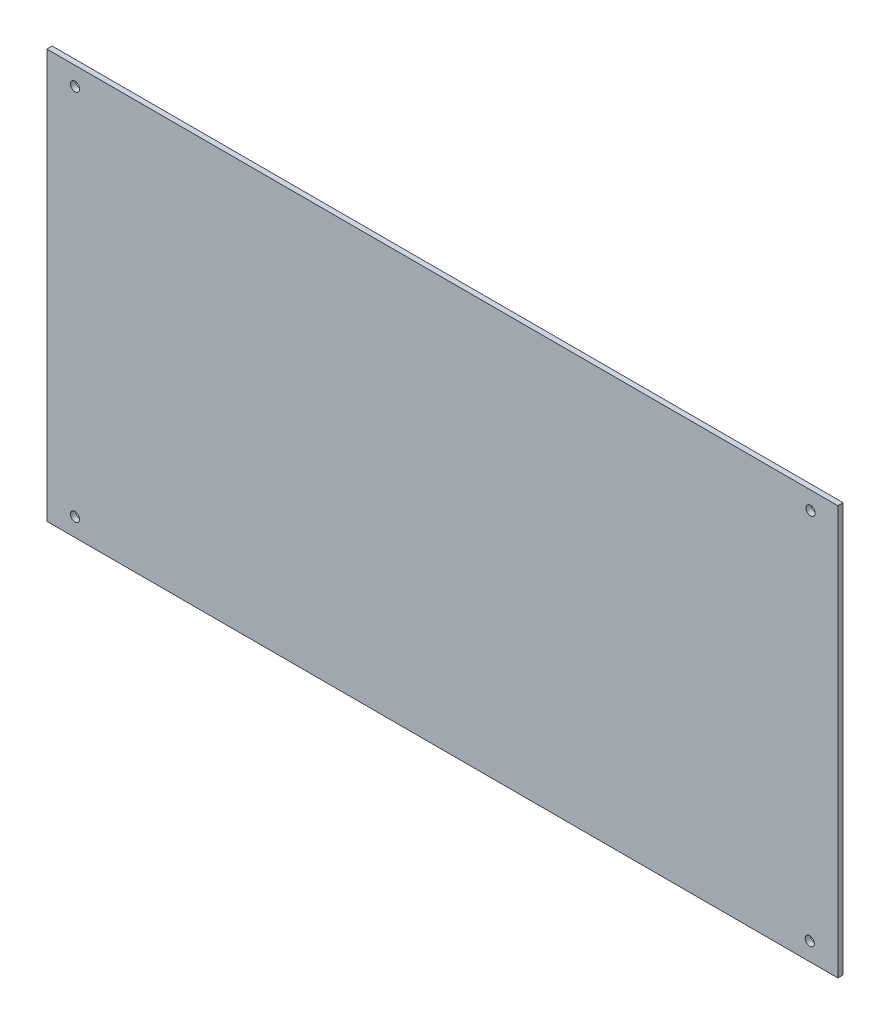
ISO-10303-21;
HEADER;
FILE_DESCRIPTION(('STEP AP214'),'2;1');
FILE_NAME('part.step','',(''),(''),'','','');
FILE_SCHEMA(('AUTOMOTIVE_DESIGN { 1 0 10303 214 1 1 1 1 }'));
ENDSEC;
DATA;
#1=APPLICATION_CONTEXT('core data for automotive mechanical design processes');
#2=APPLICATION_PROTOCOL_DEFINITION('international standard','automotive_design',2000,#1);
#3=PRODUCT_CONTEXT('',#1,'mechanical');
#4=PRODUCT('Part','Part','',(#3));
#5=PRODUCT_RELATED_PRODUCT_CATEGORY('part','',(#4));
#6=PRODUCT_DEFINITION_FORMATION('','',#4);
#7=PRODUCT_DEFINITION_CONTEXT('part definition',#1,'design');
#8=PRODUCT_DEFINITION('design','',#6,#7);
#9=PRODUCT_DEFINITION_SHAPE('','',#8);
#10=(LENGTH_UNIT() NAMED_UNIT(*) SI_UNIT(.MILLI.,.METRE.));
#11=(NAMED_UNIT(*) PLANE_ANGLE_UNIT() SI_UNIT($,.RADIAN.));
#12=(NAMED_UNIT(*) SI_UNIT($,.STERADIAN.) SOLID_ANGLE_UNIT());
#13=UNCERTAINTY_MEASURE_WITH_UNIT(LENGTH_MEASURE(1.E-05),#10,'distance_accuracy_value','');
#14=(GEOMETRIC_REPRESENTATION_CONTEXT(3) GLOBAL_UNCERTAINTY_ASSIGNED_CONTEXT((#13)) GLOBAL_UNIT_ASSIGNED_CONTEXT((#10,
#11,#12)) REPRESENTATION_CONTEXT('',''));
#15=CARTESIAN_POINT('',(0.,0.,0.));
#16=DIRECTION('',(0.,0.,1.));
#17=DIRECTION('',(1.,0.,0.));
#18=AXIS2_PLACEMENT_3D('',#15,#16,#17);
#19=CARTESIAN_POINT('',(0.,0.,3.));
#20=DIRECTION('',(-1.,0.,0.));
#21=DIRECTION('',(0.,0.,1.));
#22=AXIS2_PLACEMENT_3D('',#19,#20,#21);
#23=PLANE('',#22);
#24=DIRECTION('',(0.,1.,0.));
#25=VECTOR('',#24,1.);
#26=CARTESIAN_POINT('',(0.,0.,0.));
#27=LINE('',#26,#25);
#28=CARTESIAN_POINT('',(0.,0.,0.));
#29=VERTEX_POINT('',#28);
#30=CARTESIAN_POINT('',(0.,232.85,0.));
#31=VERTEX_POINT('',#30);
#32=EDGE_CURVE('E113',#29,#31,#27,.T.);
#33=ORIENTED_EDGE('',*,*,#32,.T.);
#34=DIRECTION('',(0.,0.,-1.));
#35=VECTOR('',#34,1.);
#36=CARTESIAN_POINT('',(0.,232.85,3.));
#37=LINE('',#36,#35);
#38=CARTESIAN_POINT('',(0.,232.85,3.));
#39=VERTEX_POINT('',#38);
#40=EDGE_CURVE('E13',#39,#31,#37,.T.);
#41=ORIENTED_EDGE('',*,*,#40,.F.);
#42=DIRECTION('',(0.,1.,0.));
#43=VECTOR('',#42,1.);
#44=CARTESIAN_POINT('',(0.,0.,3.));
#45=LINE('',#44,#43);
#46=CARTESIAN_POINT('',(0.,0.,3.));
#47=VERTEX_POINT('',#46);
#48=EDGE_CURVE('E100',#47,#39,#45,.T.);
#49=ORIENTED_EDGE('',*,*,#48,.F.);
#50=DIRECTION('',(0.,0.,-1.));
#51=VECTOR('',#50,1.);
#52=CARTESIAN_POINT('',(0.,0.,3.));
#53=LINE('',#52,#51);
#54=EDGE_CURVE('E109',#47,#29,#53,.T.);
#55=ORIENTED_EDGE('',*,*,#54,.T.);
#56=EDGE_LOOP('',(#33,#41,#49,#55));
#57=FACE_BOUND('',#56,.T.);
#58=ADVANCED_FACE('F47',(#57),#23,.F.);
#59=CARTESIAN_POINT('',(0.,232.85,3.));
#60=DIRECTION('',(0.,-1.,0.));
#61=DIRECTION('',(1.,0.,0.));
#62=AXIS2_PLACEMENT_3D('',#59,#60,#61);
#63=PLANE('',#62);
#64=DIRECTION('',(-1.,0.,0.));
#65=VECTOR('',#64,1.);
#66=CARTESIAN_POINT('',(0.,232.85,0.));
#67=LINE('',#66,#65);
#68=CARTESIAN_POINT('',(-450.3,232.85,0.));
#69=VERTEX_POINT('',#68);
#70=EDGE_CURVE('E104',#31,#69,#67,.T.);
#71=ORIENTED_EDGE('',*,*,#70,.T.);
#72=DIRECTION('',(0.,0.,-1.));
#73=VECTOR('',#72,1.);
#74=CARTESIAN_POINT('',(-450.3,232.85,3.));
#75=LINE('',#74,#73);
#76=CARTESIAN_POINT('',(-450.3,232.85,3.));
#77=VERTEX_POINT('',#76);
#78=EDGE_CURVE('E56',#77,#69,#75,.T.);
#79=ORIENTED_EDGE('',*,*,#78,.F.);
#80=DIRECTION('',(-1.,0.,0.));
#81=VECTOR('',#80,1.);
#82=CARTESIAN_POINT('',(0.,232.85,3.));
#83=LINE('',#82,#81);
#84=EDGE_CURVE('E95',#39,#77,#83,.T.);
#85=ORIENTED_EDGE('',*,*,#84,.F.);
#86=ORIENTED_EDGE('',*,*,#40,.T.);
#87=EDGE_LOOP('',(#71,#79,#85,#86));
#88=FACE_BOUND('',#87,.T.);
#89=ADVANCED_FACE('F103',(#88),#63,.F.);
#90=CARTESIAN_POINT('',(-450.3,0.,3.));
#91=DIRECTION('',(1.,0.,0.));
#92=DIRECTION('',(0.,0.,-1.));
#93=AXIS2_PLACEMENT_3D('',#90,#91,#92);
#94=PLANE('',#93);
#95=DIRECTION('',(0.,-1.,0.));
#96=VECTOR('',#95,1.);
#97=CARTESIAN_POINT('',(-450.3,0.,0.));
#98=LINE('',#97,#96);
#99=CARTESIAN_POINT('',(-450.3,0.,0.));
#100=VERTEX_POINT('',#99);
#101=EDGE_CURVE('E82',#69,#100,#98,.T.);
#102=ORIENTED_EDGE('',*,*,#101,.T.);
#103=DIRECTION('',(0.,0.,-1.));
#104=VECTOR('',#103,1.);
#105=CARTESIAN_POINT('',(-450.3,0.,3.));
#106=LINE('',#105,#104);
#107=CARTESIAN_POINT('',(-450.3,0.,3.));
#108=VERTEX_POINT('',#107);
#109=EDGE_CURVE('E105',#108,#100,#106,.T.);
#110=ORIENTED_EDGE('',*,*,#109,.F.);
#111=DIRECTION('',(0.,-1.,0.));
#112=VECTOR('',#111,1.);
#113=CARTESIAN_POINT('',(-450.3,0.,3.));
#114=LINE('',#113,#112);
#115=EDGE_CURVE('E98',#77,#108,#114,.T.);
#116=ORIENTED_EDGE('',*,*,#115,.F.);
#117=ORIENTED_EDGE('',*,*,#78,.T.);
#118=EDGE_LOOP('',(#102,#110,#116,#117));
#119=FACE_BOUND('',#118,.T.);
#120=ADVANCED_FACE('F107',(#119),#94,.F.);
#121=CARTESIAN_POINT('',(0.,0.,3.));
#122=DIRECTION('',(0.,1.,0.));
#123=DIRECTION('',(-1.,0.,0.));
#124=AXIS2_PLACEMENT_3D('',#121,#122,#123);
#125=PLANE('',#124);
#126=DIRECTION('',(1.,0.,0.));
#127=VECTOR('',#126,1.);
#128=CARTESIAN_POINT('',(0.,0.,0.));
#129=LINE('',#128,#127);
#130=EDGE_CURVE('E88',#100,#29,#129,.T.);
#131=ORIENTED_EDGE('',*,*,#130,.T.);
#132=ORIENTED_EDGE('',*,*,#54,.F.);
#133=DIRECTION('',(1.,0.,0.));
#134=VECTOR('',#133,1.);
#135=CARTESIAN_POINT('',(0.,0.,3.));
#136=LINE('',#135,#134);
#137=EDGE_CURVE('E65',#108,#47,#136,.T.);
#138=ORIENTED_EDGE('',*,*,#137,.F.);
#139=ORIENTED_EDGE('',*,*,#109,.T.);
#140=EDGE_LOOP('',(#131,#132,#138,#139));
#141=FACE_BOUND('',#140,.T.);
#142=ADVANCED_FACE('F164',(#141),#125,.F.);
#143=CARTESIAN_POINT('',(0.,0.,3.));
#144=DIRECTION('',(0.,0.,1.));
#145=DIRECTION('',(1.,0.,0.));
#146=AXIS2_PLACEMENT_3D('',#143,#144,#145);
#147=PLANE('',#146);
#148=CARTESIAN_POINT('',(-434.3,222.387328548292,3.));
#149=DIRECTION('',(0.,0.,1.));
#150=DIRECTION('',(1.,0.,0.));
#151=AXIS2_PLACEMENT_3D('',#148,#149,#150);
#152=CIRCLE('',#151,2.60000000000007);
#153=CARTESIAN_POINT('',(-431.7,222.387328548292,3.));
#154=VERTEX_POINT('',#153);
#155=EDGE_CURVE('E231',#154,#154,#152,.T.);
#156=ORIENTED_EDGE('',*,*,#155,.F.);
#157=EDGE_LOOP('',(#156));
#158=FACE_BOUND('',#157,.T.);
#159=CARTESIAN_POINT('',(-15.5490282018745,222.672231982577,3.));
#160=DIRECTION('',(0.,0.,1.));
#161=DIRECTION('',(1.,0.,0.));
#162=AXIS2_PLACEMENT_3D('',#159,#160,#161);
#163=CIRCLE('',#162,2.6);
#164=CARTESIAN_POINT('',(-12.9490282018745,222.672231982577,3.));
#165=VERTEX_POINT('',#164);
#166=EDGE_CURVE('E226',#165,#165,#163,.T.);
#167=ORIENTED_EDGE('',*,*,#166,.F.);
#168=EDGE_LOOP('',(#167));
#169=FACE_BOUND('',#168,.T.);
#170=CARTESIAN_POINT('',(-16.,10.2367973055668,3.));
#171=DIRECTION('',(0.,0.,1.));
#172=DIRECTION('',(1.,0.,0.));
#173=AXIS2_PLACEMENT_3D('',#170,#171,#172);
#174=CIRCLE('',#173,2.59999999999999);
#175=CARTESIAN_POINT('',(-13.4,10.2367973055668,3.));
#176=VERTEX_POINT('',#175);
#177=EDGE_CURVE('E219',#176,#176,#174,.T.);
#178=ORIENTED_EDGE('',*,*,#177,.F.);
#179=EDGE_LOOP('',(#178));
#180=FACE_BOUND('',#179,.T.);
#181=CARTESIAN_POINT('',(-434.3,10.2367973055667,3.));
#182=DIRECTION('',(0.,0.,1.));
#183=DIRECTION('',(1.,0.,0.));
#184=AXIS2_PLACEMENT_3D('',#181,#182,#183);
#185=CIRCLE('',#184,2.60000000000002);
#186=CARTESIAN_POINT('',(-431.7,10.2367973055667,3.));
#187=VERTEX_POINT('',#186);
#188=EDGE_CURVE('E125',#187,#187,#185,.T.);
#189=ORIENTED_EDGE('',*,*,#188,.F.);
#190=EDGE_LOOP('',(#189));
#191=FACE_BOUND('',#190,.T.);
#192=ORIENTED_EDGE('',*,*,#48,.T.);
#193=ORIENTED_EDGE('',*,*,#84,.T.);
#194=ORIENTED_EDGE('',*,*,#115,.T.);
#195=ORIENTED_EDGE('',*,*,#137,.T.);
#196=EDGE_LOOP('',(#192,#193,#194,#195));
#197=FACE_BOUND('',#196,.T.);
#198=ADVANCED_FACE('F96',(#158,#169,#180,#191,#197),#147,.T.);
#199=CARTESIAN_POINT('',(0.,0.,0.));
#200=DIRECTION('',(0.,0.,1.));
#201=DIRECTION('',(1.,0.,0.));
#202=AXIS2_PLACEMENT_3D('',#199,#200,#201);
#203=PLANE('',#202);
#204=CARTESIAN_POINT('',(-434.3,222.387328548292,0.));
#205=DIRECTION('',(0.,0.,1.));
#206=DIRECTION('',(1.,0.,0.));
#207=AXIS2_PLACEMENT_3D('',#204,#205,#206);
#208=CIRCLE('',#207,2.60000000000007);
#209=CARTESIAN_POINT('',(-431.7,222.387328548292,0.));
#210=VERTEX_POINT('',#209);
#211=EDGE_CURVE('E50',#210,#210,#208,.T.);
#212=ORIENTED_EDGE('',*,*,#211,.T.);
#213=EDGE_LOOP('',(#212));
#214=FACE_BOUND('',#213,.T.);
#215=CARTESIAN_POINT('',(-15.5490282018745,222.672231982577,0.));
#216=DIRECTION('',(0.,0.,1.));
#217=DIRECTION('',(1.,0.,0.));
#218=AXIS2_PLACEMENT_3D('',#215,#216,#217);
#219=CIRCLE('',#218,2.6);
#220=CARTESIAN_POINT('',(-12.9490282018745,222.672231982577,0.));
#221=VERTEX_POINT('',#220);
#222=EDGE_CURVE('E127',#221,#221,#219,.T.);
#223=ORIENTED_EDGE('',*,*,#222,.T.);
#224=EDGE_LOOP('',(#223));
#225=FACE_BOUND('',#224,.T.);
#226=CARTESIAN_POINT('',(-16.,10.2367973055668,0.));
#227=DIRECTION('',(0.,0.,1.));
#228=DIRECTION('',(1.,0.,0.));
#229=AXIS2_PLACEMENT_3D('',#226,#227,#228);
#230=CIRCLE('',#229,2.59999999999999);
#231=CARTESIAN_POINT('',(-13.4,10.2367973055668,0.));
#232=VERTEX_POINT('',#231);
#233=EDGE_CURVE('E124',#232,#232,#230,.T.);
#234=ORIENTED_EDGE('',*,*,#233,.T.);
#235=EDGE_LOOP('',(#234));
#236=FACE_BOUND('',#235,.T.);
#237=CARTESIAN_POINT('',(-434.3,10.2367973055667,0.));
#238=DIRECTION('',(0.,0.,1.));
#239=DIRECTION('',(1.,0.,0.));
#240=AXIS2_PLACEMENT_3D('',#237,#238,#239);
#241=CIRCLE('',#240,2.60000000000002);
#242=CARTESIAN_POINT('',(-431.7,10.2367973055667,0.));
#243=VERTEX_POINT('',#242);
#244=EDGE_CURVE('E121',#243,#243,#241,.T.);
#245=ORIENTED_EDGE('',*,*,#244,.T.);
#246=EDGE_LOOP('',(#245));
#247=FACE_BOUND('',#246,.T.);
#248=ORIENTED_EDGE('',*,*,#32,.F.);
#249=ORIENTED_EDGE('',*,*,#130,.F.);
#250=ORIENTED_EDGE('',*,*,#101,.F.);
#251=ORIENTED_EDGE('',*,*,#70,.F.);
#252=EDGE_LOOP('',(#248,#249,#250,#251));
#253=FACE_BOUND('',#252,.T.);
#254=ADVANCED_FACE('F134',(#214,#225,#236,#247,#253),#203,.F.);
#255=CARTESIAN_POINT('',(-434.3,10.2367973055667,-17.));
#256=DIRECTION('',(0.,0.,1.));
#257=DIRECTION('',(1.,0.,0.));
#258=AXIS2_PLACEMENT_3D('',#255,#256,#257);
#259=CYLINDRICAL_SURFACE('',#258,2.60000000000002);
#260=ORIENTED_EDGE('',*,*,#188,.T.);
#261=EDGE_LOOP('',(#260));
#262=FACE_BOUND('',#261,.T.);
#263=ORIENTED_EDGE('',*,*,#244,.F.);
#264=EDGE_LOOP('',(#263));
#265=FACE_BOUND('',#264,.T.);
#266=ADVANCED_FACE('F157',(#262,#265),#259,.F.);
#267=CARTESIAN_POINT('',(-16.,10.2367973055668,-17.));
#268=DIRECTION('',(0.,0.,1.));
#269=DIRECTION('',(1.,0.,0.));
#270=AXIS2_PLACEMENT_3D('',#267,#268,#269);
#271=CYLINDRICAL_SURFACE('',#270,2.59999999999999);
#272=ORIENTED_EDGE('',*,*,#177,.T.);
#273=EDGE_LOOP('',(#272));
#274=FACE_BOUND('',#273,.T.);
#275=ORIENTED_EDGE('',*,*,#233,.F.);
#276=EDGE_LOOP('',(#275));
#277=FACE_BOUND('',#276,.T.);
#278=ADVANCED_FACE('F144',(#274,#277),#271,.F.);
#279=CARTESIAN_POINT('',(-15.5490282018745,222.672231982577,-17.));
#280=DIRECTION('',(0.,0.,1.));
#281=DIRECTION('',(1.,0.,0.));
#282=AXIS2_PLACEMENT_3D('',#279,#280,#281);
#283=CYLINDRICAL_SURFACE('',#282,2.6);
#284=ORIENTED_EDGE('',*,*,#166,.T.);
#285=EDGE_LOOP('',(#284));
#286=FACE_BOUND('',#285,.T.);
#287=ORIENTED_EDGE('',*,*,#222,.F.);
#288=EDGE_LOOP('',(#287));
#289=FACE_BOUND('',#288,.T.);
#290=ADVANCED_FACE('F138',(#286,#289),#283,.F.);
#291=CARTESIAN_POINT('',(-434.3,222.387328548292,-17.));
#292=DIRECTION('',(0.,0.,1.));
#293=DIRECTION('',(1.,0.,0.));
#294=AXIS2_PLACEMENT_3D('',#291,#292,#293);
#295=CYLINDRICAL_SURFACE('',#294,2.60000000000007);
#296=ORIENTED_EDGE('',*,*,#155,.T.);
#297=EDGE_LOOP('',(#296));
#298=FACE_BOUND('',#297,.T.);
#299=ORIENTED_EDGE('',*,*,#211,.F.);
#300=EDGE_LOOP('',(#299));
#301=FACE_BOUND('',#300,.T.);
#302=ADVANCED_FACE('F136',(#298,#301),#295,.F.);
#303=CLOSED_SHELL('',(#58,#89,#120,#142,#198,#254,#266,#278,#290,#302));
#304=MANIFOLD_SOLID_BREP('B2',#303);
#305=ADVANCED_BREP_SHAPE_REPRESENTATION('',(#18,#304),#14);
#306=SHAPE_DEFINITION_REPRESENTATION(#9,#305);
ENDSEC;
END-ISO-10303-21;
